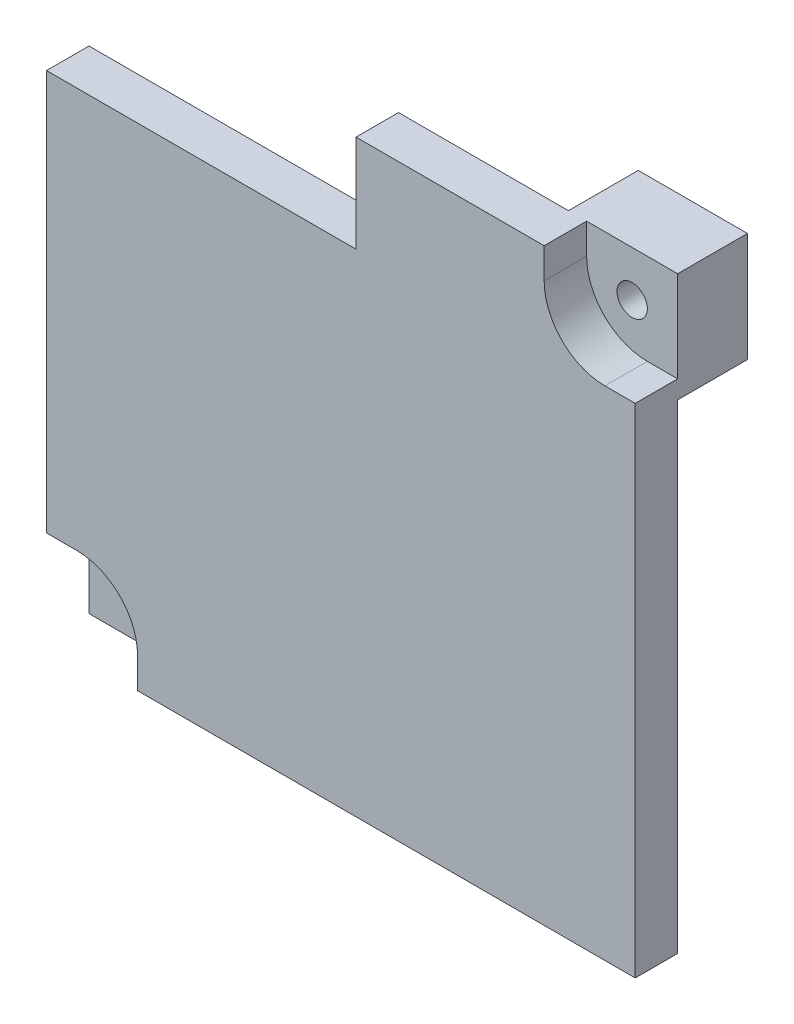
ISO-10303-21;
HEADER;
FILE_DESCRIPTION(('STEP AP214'),'2;1');
FILE_NAME('part.step','',(''),(''),'','','');
FILE_SCHEMA(('AUTOMOTIVE_DESIGN { 1 0 10303 214 1 1 1 1 }'));
ENDSEC;
DATA;
#1=APPLICATION_CONTEXT('core data for automotive mechanical design processes');
#2=APPLICATION_PROTOCOL_DEFINITION('international standard','automotive_design',2000,#1);
#3=PRODUCT_CONTEXT('',#1,'mechanical');
#4=PRODUCT('Part','Part','',(#3));
#5=PRODUCT_RELATED_PRODUCT_CATEGORY('part','',(#4));
#6=PRODUCT_DEFINITION_FORMATION('','',#4);
#7=PRODUCT_DEFINITION_CONTEXT('part definition',#1,'design');
#8=PRODUCT_DEFINITION('design','',#6,#7);
#9=PRODUCT_DEFINITION_SHAPE('','',#8);
#10=(LENGTH_UNIT() NAMED_UNIT(*) SI_UNIT(.MILLI.,.METRE.));
#11=(NAMED_UNIT(*) PLANE_ANGLE_UNIT() SI_UNIT($,.RADIAN.));
#12=(NAMED_UNIT(*) SI_UNIT($,.STERADIAN.) SOLID_ANGLE_UNIT());
#13=UNCERTAINTY_MEASURE_WITH_UNIT(LENGTH_MEASURE(1.E-05),#10,'distance_accuracy_value','');
#14=(GEOMETRIC_REPRESENTATION_CONTEXT(3) GLOBAL_UNCERTAINTY_ASSIGNED_CONTEXT((#13)) GLOBAL_UNIT_ASSIGNED_CONTEXT((#10,
#11,#12)) REPRESENTATION_CONTEXT('',''));
#15=CARTESIAN_POINT('',(0.,0.,0.));
#16=DIRECTION('',(0.,0.,1.));
#17=DIRECTION('',(1.,0.,0.));
#18=AXIS2_PLACEMENT_3D('',#15,#16,#17);
#19=CARTESIAN_POINT('',(0.,0.,0.));
#20=DIRECTION('',(0.,0.,1.));
#21=DIRECTION('',(1.,0.,0.));
#22=AXIS2_PLACEMENT_3D('',#19,#20,#21);
#23=PLANE('',#22);
#24=DIRECTION('',(0.,1.,0.));
#25=VECTOR('',#24,1.);
#26=CARTESIAN_POINT('',(6.1,6.1,0.));
#27=LINE('',#26,#25);
#28=CARTESIAN_POINT('',(6.1,6.1,0.));
#29=VERTEX_POINT('',#28);
#30=CARTESIAN_POINT('',(6.1,9.7,0.));
#31=VERTEX_POINT('',#30);
#32=EDGE_CURVE('E426',#29,#31,#27,.T.);
#33=ORIENTED_EDGE('',*,*,#32,.F.);
#34=DIRECTION('',(-1.,0.,0.));
#35=VECTOR('',#34,1.);
#36=CARTESIAN_POINT('',(9.7,6.1,0.));
#37=LINE('',#36,#35);
#38=CARTESIAN_POINT('',(9.7,6.1,0.));
#39=VERTEX_POINT('',#38);
#40=EDGE_CURVE('E67',#39,#29,#37,.T.);
#41=ORIENTED_EDGE('',*,*,#40,.F.);
#42=DIRECTION('',(0.,1.,0.));
#43=VECTOR('',#42,1.);
#44=CARTESIAN_POINT('',(9.7,0.,0.));
#45=LINE('',#44,#43);
#46=CARTESIAN_POINT('',(9.7,-9.7,0.));
#47=VERTEX_POINT('',#46);
#48=EDGE_CURVE('E207',#47,#39,#45,.T.);
#49=ORIENTED_EDGE('',*,*,#48,.F.);
#50=DIRECTION('',(-1.,0.,0.));
#51=VECTOR('',#50,1.);
#52=CARTESIAN_POINT('',(0.,-9.7,0.));
#53=LINE('',#52,#51);
#54=CARTESIAN_POINT('',(-0.199999999999997,-9.7,0.));
#55=VERTEX_POINT('',#54);
#56=EDGE_CURVE('E63',#47,#55,#53,.T.);
#57=ORIENTED_EDGE('',*,*,#56,.T.);
#58=DIRECTION('',(0.,-1.,0.));
#59=VECTOR('',#58,1.);
#60=CARTESIAN_POINT('',(-0.199999999999997,-9.7,0.));
#61=LINE('',#60,#59);
#62=CARTESIAN_POINT('',(-0.199999999999997,-0.199999999999995,0.));
#63=VERTEX_POINT('',#62);
#64=EDGE_CURVE('E253',#63,#55,#61,.T.);
#65=ORIENTED_EDGE('',*,*,#64,.F.);
#66=DIRECTION('',(1.,0.,0.));
#67=VECTOR('',#66,1.);
#68=CARTESIAN_POINT('',(-0.199999999999997,-0.199999999999995,0.));
#69=LINE('',#68,#67);
#70=CARTESIAN_POINT('',(-9.7,-0.199999999999995,0.));
#71=VERTEX_POINT('',#70);
#72=EDGE_CURVE('E239',#71,#63,#69,.T.);
#73=ORIENTED_EDGE('',*,*,#72,.F.);
#74=DIRECTION('',(0.,1.,0.));
#75=VECTOR('',#74,1.);
#76=CARTESIAN_POINT('',(-9.7,0.,0.));
#77=LINE('',#76,#75);
#78=CARTESIAN_POINT('',(-9.7,6.5,0.));
#79=VERTEX_POINT('',#78);
#80=EDGE_CURVE('E337',#71,#79,#77,.T.);
#81=ORIENTED_EDGE('',*,*,#80,.T.);
#82=DIRECTION('',(1.,0.,0.));
#83=VECTOR('',#82,1.);
#84=CARTESIAN_POINT('',(0.,6.5,0.));
#85=LINE('',#84,#83);
#86=CARTESIAN_POINT('',(0.499999999999997,6.5,0.));
#87=VERTEX_POINT('',#86);
#88=EDGE_CURVE('E339',#79,#87,#85,.T.);
#89=ORIENTED_EDGE('',*,*,#88,.T.);
#90=DIRECTION('',(0.,-1.,0.));
#91=VECTOR('',#90,1.);
#92=CARTESIAN_POINT('',(0.499999999999998,0.,0.));
#93=LINE('',#92,#91);
#94=CARTESIAN_POINT('',(0.499999999999997,9.7,0.));
#95=VERTEX_POINT('',#94);
#96=EDGE_CURVE('E335',#95,#87,#93,.T.);
#97=ORIENTED_EDGE('',*,*,#96,.F.);
#98=DIRECTION('',(-1.,0.,0.));
#99=VECTOR('',#98,1.);
#100=CARTESIAN_POINT('',(0.,9.7,0.));
#101=LINE('',#100,#99);
#102=EDGE_CURVE('E328',#31,#95,#101,.T.);
#103=ORIENTED_EDGE('',*,*,#102,.F.);
#104=EDGE_LOOP('',(#33,#41,#49,#57,#65,#73,#81,#89,#97,#103));
#105=FACE_BOUND('',#104,.T.);
#106=ADVANCED_FACE('F50',(#105),#23,.F.);
#107=CARTESIAN_POINT('',(-8.7,-8.7,1.4));
#108=DIRECTION('',(0.,0.,-1.));
#109=DIRECTION('',(-1.,0.,0.));
#110=AXIS2_PLACEMENT_3D('',#107,#108,#109);
#111=CYLINDRICAL_SURFACE('',#110,2.);
#112=CARTESIAN_POINT('',(-8.7,-8.7,0.));
#113=DIRECTION('',(0.,0.,1.));
#114=DIRECTION('',(1.,0.,0.));
#115=AXIS2_PLACEMENT_3D('',#112,#113,#114);
#116=CIRCLE('',#115,2.);
#117=CARTESIAN_POINT('',(-6.7,-8.70000000000001,0.));
#118=VERTEX_POINT('',#117);
#119=CARTESIAN_POINT('',(-8.70000000000001,-6.7,0.));
#120=VERTEX_POINT('',#119);
#121=EDGE_CURVE('E211',#118,#120,#116,.T.);
#122=ORIENTED_EDGE('',*,*,#121,.F.);
#123=DIRECTION('',(0.,0.,-1.));
#124=VECTOR('',#123,1.);
#125=CARTESIAN_POINT('',(-6.7,-8.70000000000001,1.4));
#126=LINE('',#125,#124);
#127=CARTESIAN_POINT('',(-6.7,-8.70000000000001,1.4));
#128=VERTEX_POINT('',#127);
#129=EDGE_CURVE('E11',#128,#118,#126,.T.);
#130=ORIENTED_EDGE('',*,*,#129,.F.);
#131=CARTESIAN_POINT('',(-8.7,-8.7,1.4));
#132=DIRECTION('',(0.,0.,1.));
#133=DIRECTION('',(1.,0.,0.));
#134=AXIS2_PLACEMENT_3D('',#131,#132,#133);
#135=CIRCLE('',#134,2.);
#136=CARTESIAN_POINT('',(-8.70000000000001,-6.7,1.4));
#137=VERTEX_POINT('',#136);
#138=EDGE_CURVE('E270',#128,#137,#135,.T.);
#139=ORIENTED_EDGE('',*,*,#138,.T.);
#140=DIRECTION('',(0.,0.,-1.));
#141=VECTOR('',#140,1.);
#142=CARTESIAN_POINT('',(-8.70000000000001,-6.7,1.4));
#143=LINE('',#142,#141);
#144=EDGE_CURVE('E310',#137,#120,#143,.T.);
#145=ORIENTED_EDGE('',*,*,#144,.T.);
#146=EDGE_LOOP('',(#122,#130,#139,#145));
#147=FACE_BOUND('',#146,.T.);
#148=ADVANCED_FACE('F47',(#147),#111,.F.);
#149=CARTESIAN_POINT('',(-6.7,0.,1.4));
#150=DIRECTION('',(-1.,0.,0.));
#151=DIRECTION('',(0.,0.,1.));
#152=AXIS2_PLACEMENT_3D('',#149,#150,#151);
#153=PLANE('',#152);
#154=DIRECTION('',(0.,1.,0.));
#155=VECTOR('',#154,1.);
#156=CARTESIAN_POINT('',(-6.7,0.,0.));
#157=LINE('',#156,#155);
#158=CARTESIAN_POINT('',(-6.7,-9.7,0.));
#159=VERTEX_POINT('',#158);
#160=EDGE_CURVE('E216',#159,#118,#157,.T.);
#161=ORIENTED_EDGE('',*,*,#160,.F.);
#162=DIRECTION('',(0.,0.,-1.));
#163=VECTOR('',#162,1.);
#164=CARTESIAN_POINT('',(-6.7,-9.7,1.4));
#165=LINE('',#164,#163);
#166=CARTESIAN_POINT('',(-6.7,-9.7,1.4));
#167=VERTEX_POINT('',#166);
#168=EDGE_CURVE('E60',#167,#159,#165,.T.);
#169=ORIENTED_EDGE('',*,*,#168,.F.);
#170=DIRECTION('',(0.,1.,0.));
#171=VECTOR('',#170,1.);
#172=CARTESIAN_POINT('',(-6.7,0.,1.4));
#173=LINE('',#172,#171);
#174=EDGE_CURVE('E271',#167,#128,#173,.T.);
#175=ORIENTED_EDGE('',*,*,#174,.T.);
#176=ORIENTED_EDGE('',*,*,#129,.T.);
#177=EDGE_LOOP('',(#161,#169,#175,#176));
#178=FACE_BOUND('',#177,.T.);
#179=ADVANCED_FACE('F390',(#178),#153,.T.);
#180=CARTESIAN_POINT('',(0.,-9.7,1.4));
#181=DIRECTION('',(0.,-1.,0.));
#182=DIRECTION('',(1.,0.,0.));
#183=AXIS2_PLACEMENT_3D('',#180,#181,#182);
#184=PLANE('',#183);
#185=ORIENTED_EDGE('',*,*,#56,.F.);
#186=DIRECTION('',(0.,0.,-1.));
#187=VECTOR('',#186,1.);
#188=CARTESIAN_POINT('',(9.7,-9.7,1.4));
#189=LINE('',#188,#187);
#190=CARTESIAN_POINT('',(9.7,-9.7,1.4));
#191=VERTEX_POINT('',#190);
#192=EDGE_CURVE('E374',#191,#47,#189,.T.);
#193=ORIENTED_EDGE('',*,*,#192,.F.);
#194=DIRECTION('',(-1.,0.,0.));
#195=VECTOR('',#194,1.);
#196=CARTESIAN_POINT('',(0.,-9.7,1.4));
#197=LINE('',#196,#195);
#198=EDGE_CURVE('E277',#191,#167,#197,.T.);
#199=ORIENTED_EDGE('',*,*,#198,.T.);
#200=ORIENTED_EDGE('',*,*,#168,.T.);
#201=DIRECTION('',(-1.,0.,0.));
#202=VECTOR('',#201,1.);
#203=CARTESIAN_POINT('',(-0.199999999999997,-9.7,0.));
#204=LINE('',#203,#202);
#205=CARTESIAN_POINT('',(-9.7,-9.7,0.));
#206=VERTEX_POINT('',#205);
#207=EDGE_CURVE('E246',#159,#206,#204,.T.);
#208=ORIENTED_EDGE('',*,*,#207,.T.);
#209=DIRECTION('',(0.,0.,1.));
#210=VECTOR('',#209,1.);
#211=CARTESIAN_POINT('',(-9.7,-9.7,-2.3));
#212=LINE('',#211,#210);
#213=CARTESIAN_POINT('',(-9.7,-9.7,-2.3));
#214=VERTEX_POINT('',#213);
#215=EDGE_CURVE('E223',#214,#206,#212,.T.);
#216=ORIENTED_EDGE('',*,*,#215,.F.);
#217=DIRECTION('',(-1.,0.,0.));
#218=VECTOR('',#217,1.);
#219=CARTESIAN_POINT('',(-0.199999999999997,-9.7,-2.3));
#220=LINE('',#219,#218);
#221=CARTESIAN_POINT('',(-0.199999999999997,-9.7,-2.3));
#222=VERTEX_POINT('',#221);
#223=EDGE_CURVE('E261',#222,#214,#220,.T.);
#224=ORIENTED_EDGE('',*,*,#223,.F.);
#225=DIRECTION('',(0.,0.,1.));
#226=VECTOR('',#225,1.);
#227=CARTESIAN_POINT('',(-0.199999999999997,-9.7,-2.3));
#228=LINE('',#227,#226);
#229=EDGE_CURVE('E225',#222,#55,#228,.T.);
#230=ORIENTED_EDGE('',*,*,#229,.T.);
#231=EDGE_LOOP('',(#185,#193,#199,#200,#208,#216,#224,#230));
#232=FACE_BOUND('',#231,.T.);
#233=ADVANCED_FACE('F381',(#232),#184,.T.);
#234=CARTESIAN_POINT('',(9.7,0.,1.4));
#235=DIRECTION('',(-1.,0.,0.));
#236=DIRECTION('',(0.,-1.,0.));
#237=AXIS2_PLACEMENT_3D('',#234,#235,#236);
#238=PLANE('',#237);
#239=ORIENTED_EDGE('',*,*,#48,.T.);
#240=DIRECTION('',(0.,0.,1.));
#241=VECTOR('',#240,1.);
#242=CARTESIAN_POINT('',(9.7,6.1,-2.3));
#243=LINE('',#242,#241);
#244=CARTESIAN_POINT('',(9.7,6.1,-2.3));
#245=VERTEX_POINT('',#244);
#246=EDGE_CURVE('E188',#245,#39,#243,.T.);
#247=ORIENTED_EDGE('',*,*,#246,.F.);
#248=DIRECTION('',(0.,-1.,0.));
#249=VECTOR('',#248,1.);
#250=CARTESIAN_POINT('',(9.7,6.1,-2.3));
#251=LINE('',#250,#249);
#252=CARTESIAN_POINT('',(9.7,9.7,-2.3));
#253=VERTEX_POINT('',#252);
#254=EDGE_CURVE('E198',#253,#245,#251,.T.);
#255=ORIENTED_EDGE('',*,*,#254,.F.);
#256=DIRECTION('',(0.,0.,1.));
#257=VECTOR('',#256,1.);
#258=CARTESIAN_POINT('',(9.7,9.7,-2.3));
#259=LINE('',#258,#257);
#260=CARTESIAN_POINT('',(9.7,9.7,0.));
#261=VERTEX_POINT('',#260);
#262=EDGE_CURVE('E440',#253,#261,#259,.T.);
#263=ORIENTED_EDGE('',*,*,#262,.T.);
#264=DIRECTION('',(0.,-1.,0.));
#265=VECTOR('',#264,1.);
#266=CARTESIAN_POINT('',(9.7,6.1,0.));
#267=LINE('',#266,#265);
#268=CARTESIAN_POINT('',(9.7,6.7,0.));
#269=VERTEX_POINT('',#268);
#270=EDGE_CURVE('E254',#261,#269,#267,.T.);
#271=ORIENTED_EDGE('',*,*,#270,.T.);
#272=DIRECTION('',(0.,0.,-1.));
#273=VECTOR('',#272,1.);
#274=CARTESIAN_POINT('',(9.7,6.7,1.4));
#275=LINE('',#274,#273);
#276=CARTESIAN_POINT('',(9.7,6.7,1.4));
#277=VERTEX_POINT('',#276);
#278=EDGE_CURVE('E375',#277,#269,#275,.T.);
#279=ORIENTED_EDGE('',*,*,#278,.F.);
#280=DIRECTION('',(0.,1.,0.));
#281=VECTOR('',#280,1.);
#282=CARTESIAN_POINT('',(9.7,0.,1.4));
#283=LINE('',#282,#281);
#284=EDGE_CURVE('E278',#191,#277,#283,.T.);
#285=ORIENTED_EDGE('',*,*,#284,.F.);
#286=ORIENTED_EDGE('',*,*,#192,.T.);
#287=EDGE_LOOP('',(#239,#247,#255,#263,#271,#279,#285,#286));
#288=FACE_BOUND('',#287,.T.);
#289=ADVANCED_FACE('F208',(#288),#238,.F.);
#290=CARTESIAN_POINT('',(0.,6.7,1.4));
#291=DIRECTION('',(0.,-1.,0.));
#292=DIRECTION('',(0.,0.,-1.));
#293=AXIS2_PLACEMENT_3D('',#290,#291,#292);
#294=PLANE('',#293);
#295=DIRECTION('',(-1.,0.,0.));
#296=VECTOR('',#295,1.);
#297=CARTESIAN_POINT('',(0.,6.7,0.));
#298=LINE('',#297,#296);
#299=CARTESIAN_POINT('',(8.70000000000002,6.7,0.));
#300=VERTEX_POINT('',#299);
#301=EDGE_CURVE('E318',#269,#300,#298,.T.);
#302=ORIENTED_EDGE('',*,*,#301,.T.);
#303=DIRECTION('',(0.,0.,-1.));
#304=VECTOR('',#303,1.);
#305=CARTESIAN_POINT('',(8.70000000000002,6.7,1.4));
#306=LINE('',#305,#304);
#307=CARTESIAN_POINT('',(8.70000000000002,6.7,1.4));
#308=VERTEX_POINT('',#307);
#309=EDGE_CURVE('E366',#308,#300,#306,.T.);
#310=ORIENTED_EDGE('',*,*,#309,.F.);
#311=DIRECTION('',(-1.,0.,0.));
#312=VECTOR('',#311,1.);
#313=CARTESIAN_POINT('',(0.,6.7,1.4));
#314=LINE('',#313,#312);
#315=EDGE_CURVE('E285',#277,#308,#314,.T.);
#316=ORIENTED_EDGE('',*,*,#315,.F.);
#317=ORIENTED_EDGE('',*,*,#278,.T.);
#318=EDGE_LOOP('',(#302,#310,#316,#317));
#319=FACE_BOUND('',#318,.T.);
#320=ADVANCED_FACE('F460',(#319),#294,.F.);
#321=CARTESIAN_POINT('',(8.7,8.7,1.4));
#322=DIRECTION('',(0.,0.,-1.));
#323=DIRECTION('',(-1.,0.,0.));
#324=AXIS2_PLACEMENT_3D('',#321,#322,#323);
#325=CYLINDRICAL_SURFACE('',#324,2.);
#326=CARTESIAN_POINT('',(8.7,8.7,0.));
#327=DIRECTION('',(0.,0.,1.));
#328=DIRECTION('',(1.,0.,0.));
#329=AXIS2_PLACEMENT_3D('',#326,#327,#328);
#330=CIRCLE('',#329,2.);
#331=CARTESIAN_POINT('',(6.7,8.70000000000001,0.));
#332=VERTEX_POINT('',#331);
#333=EDGE_CURVE('E321',#300,#332,#330,.F.);
#334=ORIENTED_EDGE('',*,*,#333,.T.);
#335=DIRECTION('',(0.,0.,-1.));
#336=VECTOR('',#335,1.);
#337=CARTESIAN_POINT('',(6.7,8.70000000000001,1.4));
#338=LINE('',#337,#336);
#339=CARTESIAN_POINT('',(6.7,8.70000000000001,1.4));
#340=VERTEX_POINT('',#339);
#341=EDGE_CURVE('E364',#340,#332,#338,.T.);
#342=ORIENTED_EDGE('',*,*,#341,.F.);
#343=CARTESIAN_POINT('',(8.7,8.7,1.4));
#344=DIRECTION('',(0.,0.,1.));
#345=DIRECTION('',(1.,0.,0.));
#346=AXIS2_PLACEMENT_3D('',#343,#344,#345);
#347=CIRCLE('',#346,2.);
#348=EDGE_CURVE('E288',#308,#340,#347,.F.);
#349=ORIENTED_EDGE('',*,*,#348,.F.);
#350=ORIENTED_EDGE('',*,*,#309,.T.);
#351=EDGE_LOOP('',(#334,#342,#349,#350));
#352=FACE_BOUND('',#351,.T.);
#353=ADVANCED_FACE('F458',(#352),#325,.F.);
#354=CARTESIAN_POINT('',(6.70000000000001,0.,1.4));
#355=DIRECTION('',(1.,0.,0.));
#356=DIRECTION('',(0.,1.,0.));
#357=AXIS2_PLACEMENT_3D('',#354,#355,#356);
#358=PLANE('',#357);
#359=DIRECTION('',(0.,-1.,0.));
#360=VECTOR('',#359,1.);
#361=CARTESIAN_POINT('',(6.70000000000001,0.,0.));
#362=LINE('',#361,#360);
#363=CARTESIAN_POINT('',(6.7,9.7,0.));
#364=VERTEX_POINT('',#363);
#365=EDGE_CURVE('E324',#364,#332,#362,.T.);
#366=ORIENTED_EDGE('',*,*,#365,.F.);
#367=DIRECTION('',(0.,0.,-1.));
#368=VECTOR('',#367,1.);
#369=CARTESIAN_POINT('',(6.7,9.7,1.4));
#370=LINE('',#369,#368);
#371=CARTESIAN_POINT('',(6.7,9.7,1.4));
#372=VERTEX_POINT('',#371);
#373=EDGE_CURVE('E362',#372,#364,#370,.T.);
#374=ORIENTED_EDGE('',*,*,#373,.F.);
#375=DIRECTION('',(0.,-1.,0.));
#376=VECTOR('',#375,1.);
#377=CARTESIAN_POINT('',(6.70000000000001,0.,1.4));
#378=LINE('',#377,#376);
#379=EDGE_CURVE('E289',#372,#340,#378,.T.);
#380=ORIENTED_EDGE('',*,*,#379,.T.);
#381=ORIENTED_EDGE('',*,*,#341,.T.);
#382=EDGE_LOOP('',(#366,#374,#380,#381));
#383=FACE_BOUND('',#382,.T.);
#384=ADVANCED_FACE('F625',(#383),#358,.T.);
#385=CARTESIAN_POINT('',(0.,9.7,1.4));
#386=DIRECTION('',(0.,-1.,0.));
#387=DIRECTION('',(1.,0.,0.));
#388=AXIS2_PLACEMENT_3D('',#385,#386,#387);
#389=PLANE('',#388);
#390=ORIENTED_EDGE('',*,*,#373,.T.);
#391=DIRECTION('',(1.,0.,0.));
#392=VECTOR('',#391,1.);
#393=CARTESIAN_POINT('',(9.7,9.7,0.));
#394=LINE('',#393,#392);
#395=EDGE_CURVE('E206',#364,#261,#394,.T.);
#396=ORIENTED_EDGE('',*,*,#395,.T.);
#397=ORIENTED_EDGE('',*,*,#262,.F.);
#398=DIRECTION('',(1.,0.,0.));
#399=VECTOR('',#398,1.);
#400=CARTESIAN_POINT('',(9.7,9.7,-2.3));
#401=LINE('',#400,#399);
#402=CARTESIAN_POINT('',(6.1,9.7,-2.3));
#403=VERTEX_POINT('',#402);
#404=EDGE_CURVE('E203',#403,#253,#401,.T.);
#405=ORIENTED_EDGE('',*,*,#404,.F.);
#406=DIRECTION('',(0.,0.,1.));
#407=VECTOR('',#406,1.);
#408=CARTESIAN_POINT('',(6.1,9.7,-2.3));
#409=LINE('',#408,#407);
#410=EDGE_CURVE('E217',#403,#31,#409,.T.);
#411=ORIENTED_EDGE('',*,*,#410,.T.);
#412=ORIENTED_EDGE('',*,*,#102,.T.);
#413=DIRECTION('',(0.,0.,-1.));
#414=VECTOR('',#413,1.);
#415=CARTESIAN_POINT('',(0.499999999999997,9.7,1.4));
#416=LINE('',#415,#414);
#417=CARTESIAN_POINT('',(0.499999999999997,9.7,1.4));
#418=VERTEX_POINT('',#417);
#419=EDGE_CURVE('E356',#418,#95,#416,.T.);
#420=ORIENTED_EDGE('',*,*,#419,.F.);
#421=DIRECTION('',(-1.,0.,0.));
#422=VECTOR('',#421,1.);
#423=CARTESIAN_POINT('',(0.,9.7,1.4));
#424=LINE('',#423,#422);
#425=EDGE_CURVE('E291',#372,#418,#424,.T.);
#426=ORIENTED_EDGE('',*,*,#425,.F.);
#427=EDGE_LOOP('',(#390,#396,#397,#405,#411,#412,#420,#426));
#428=FACE_BOUND('',#427,.T.);
#429=ADVANCED_FACE('F423',(#428),#389,.F.);
#430=CARTESIAN_POINT('',(0.499999999999998,0.,1.4));
#431=DIRECTION('',(1.,0.,0.));
#432=DIRECTION('',(0.,1.,0.));
#433=AXIS2_PLACEMENT_3D('',#430,#431,#432);
#434=PLANE('',#433);
#435=ORIENTED_EDGE('',*,*,#96,.T.);
#436=DIRECTION('',(0.,0.,-1.));
#437=VECTOR('',#436,1.);
#438=CARTESIAN_POINT('',(0.499999999999997,6.5,1.4));
#439=LINE('',#438,#437);
#440=CARTESIAN_POINT('',(0.499999999999997,6.5,1.4));
#441=VERTEX_POINT('',#440);
#442=EDGE_CURVE('E352',#441,#87,#439,.T.);
#443=ORIENTED_EDGE('',*,*,#442,.F.);
#444=DIRECTION('',(0.,-1.,0.));
#445=VECTOR('',#444,1.);
#446=CARTESIAN_POINT('',(0.499999999999998,0.,1.4));
#447=LINE('',#446,#445);
#448=EDGE_CURVE('E299',#418,#441,#447,.T.);
#449=ORIENTED_EDGE('',*,*,#448,.F.);
#450=ORIENTED_EDGE('',*,*,#419,.T.);
#451=EDGE_LOOP('',(#435,#443,#449,#450));
#452=FACE_BOUND('',#451,.T.);
#453=ADVANCED_FACE('F417',(#452),#434,.F.);
#454=CARTESIAN_POINT('',(0.,6.5,1.4));
#455=DIRECTION('',(0.,1.,0.));
#456=DIRECTION('',(0.,0.,1.));
#457=AXIS2_PLACEMENT_3D('',#454,#455,#456);
#458=PLANE('',#457);
#459=ORIENTED_EDGE('',*,*,#88,.F.);
#460=DIRECTION('',(0.,0.,-1.));
#461=VECTOR('',#460,1.);
#462=CARTESIAN_POINT('',(-9.7,6.5,1.4));
#463=LINE('',#462,#461);
#464=CARTESIAN_POINT('',(-9.7,6.5,1.4));
#465=VERTEX_POINT('',#464);
#466=EDGE_CURVE('E354',#465,#79,#463,.T.);
#467=ORIENTED_EDGE('',*,*,#466,.F.);
#468=DIRECTION('',(1.,0.,0.));
#469=VECTOR('',#468,1.);
#470=CARTESIAN_POINT('',(0.,6.5,1.4));
#471=LINE('',#470,#469);
#472=EDGE_CURVE('E298',#465,#441,#471,.T.);
#473=ORIENTED_EDGE('',*,*,#472,.T.);
#474=ORIENTED_EDGE('',*,*,#442,.T.);
#475=EDGE_LOOP('',(#459,#467,#473,#474));
#476=FACE_BOUND('',#475,.T.);
#477=ADVANCED_FACE('F415',(#476),#458,.T.);
#478=CARTESIAN_POINT('',(-9.7,0.,1.4));
#479=DIRECTION('',(-1.,0.,0.));
#480=DIRECTION('',(0.,-1.,0.));
#481=AXIS2_PLACEMENT_3D('',#478,#479,#480);
#482=PLANE('',#481);
#483=ORIENTED_EDGE('',*,*,#80,.F.);
#484=DIRECTION('',(0.,0.,1.));
#485=VECTOR('',#484,1.);
#486=CARTESIAN_POINT('',(-9.7,-0.199999999999995,-2.3));
#487=LINE('',#486,#485);
#488=CARTESIAN_POINT('',(-9.7,-0.199999999999995,-2.3));
#489=VERTEX_POINT('',#488);
#490=EDGE_CURVE('E227',#489,#71,#487,.T.);
#491=ORIENTED_EDGE('',*,*,#490,.F.);
#492=DIRECTION('',(0.,1.,0.));
#493=VECTOR('',#492,1.);
#494=CARTESIAN_POINT('',(-9.7,-9.7,-2.3));
#495=LINE('',#494,#493);
#496=EDGE_CURVE('E256',#214,#489,#495,.T.);
#497=ORIENTED_EDGE('',*,*,#496,.F.);
#498=ORIENTED_EDGE('',*,*,#215,.T.);
#499=DIRECTION('',(0.,1.,0.));
#500=VECTOR('',#499,1.);
#501=CARTESIAN_POINT('',(-9.7,-9.7,0.));
#502=LINE('',#501,#500);
#503=CARTESIAN_POINT('',(-9.7,-6.7,0.));
#504=VERTEX_POINT('',#503);
#505=EDGE_CURVE('E245',#206,#504,#502,.T.);
#506=ORIENTED_EDGE('',*,*,#505,.T.);
#507=DIRECTION('',(0.,0.,-1.));
#508=VECTOR('',#507,1.);
#509=CARTESIAN_POINT('',(-9.7,-6.7,1.4));
#510=LINE('',#509,#508);
#511=CARTESIAN_POINT('',(-9.7,-6.7,1.4));
#512=VERTEX_POINT('',#511);
#513=EDGE_CURVE('E346',#512,#504,#510,.T.);
#514=ORIENTED_EDGE('',*,*,#513,.F.);
#515=DIRECTION('',(0.,1.,0.));
#516=VECTOR('',#515,1.);
#517=CARTESIAN_POINT('',(-9.7,0.,1.4));
#518=LINE('',#517,#516);
#519=EDGE_CURVE('E301',#512,#465,#518,.T.);
#520=ORIENTED_EDGE('',*,*,#519,.T.);
#521=ORIENTED_EDGE('',*,*,#466,.T.);
#522=EDGE_LOOP('',(#483,#491,#497,#498,#506,#514,#520,#521));
#523=FACE_BOUND('',#522,.T.);
#524=ADVANCED_FACE('F392',(#523),#482,.T.);
#525=CARTESIAN_POINT('',(0.,-6.7,1.4));
#526=DIRECTION('',(0.,1.,0.));
#527=DIRECTION('',(0.,0.,1.));
#528=AXIS2_PLACEMENT_3D('',#525,#526,#527);
#529=PLANE('',#528);
#530=DIRECTION('',(1.,0.,0.));
#531=VECTOR('',#530,1.);
#532=CARTESIAN_POINT('',(0.,-6.7,0.));
#533=LINE('',#532,#531);
#534=EDGE_CURVE('E275',#504,#120,#533,.T.);
#535=ORIENTED_EDGE('',*,*,#534,.T.);
#536=ORIENTED_EDGE('',*,*,#144,.F.);
#537=DIRECTION('',(1.,0.,0.));
#538=VECTOR('',#537,1.);
#539=CARTESIAN_POINT('',(0.,-6.7,1.4));
#540=LINE('',#539,#538);
#541=EDGE_CURVE('E307',#512,#137,#540,.T.);
#542=ORIENTED_EDGE('',*,*,#541,.F.);
#543=ORIENTED_EDGE('',*,*,#513,.T.);
#544=EDGE_LOOP('',(#535,#536,#542,#543));
#545=FACE_BOUND('',#544,.T.);
#546=ADVANCED_FACE('F469',(#545),#529,.F.);
#547=CARTESIAN_POINT('',(0.,0.,1.4));
#548=DIRECTION('',(0.,0.,1.));
#549=DIRECTION('',(1.,0.,0.));
#550=AXIS2_PLACEMENT_3D('',#547,#548,#549);
#551=PLANE('',#550);
#552=ORIENTED_EDGE('',*,*,#138,.F.);
#553=ORIENTED_EDGE('',*,*,#174,.F.);
#554=ORIENTED_EDGE('',*,*,#198,.F.);
#555=ORIENTED_EDGE('',*,*,#284,.T.);
#556=ORIENTED_EDGE('',*,*,#315,.T.);
#557=ORIENTED_EDGE('',*,*,#348,.T.);
#558=ORIENTED_EDGE('',*,*,#379,.F.);
#559=ORIENTED_EDGE('',*,*,#425,.T.);
#560=ORIENTED_EDGE('',*,*,#448,.T.);
#561=ORIENTED_EDGE('',*,*,#472,.F.);
#562=ORIENTED_EDGE('',*,*,#519,.F.);
#563=ORIENTED_EDGE('',*,*,#541,.T.);
#564=EDGE_LOOP('',(#552,#553,#554,#555,#556,#557,#558,#559,#560,#561,#562,#563));
#565=FACE_BOUND('',#564,.T.);
#566=ADVANCED_FACE('F463',(#565),#551,.T.);
#567=CARTESIAN_POINT('',(0.,0.,0.));
#568=DIRECTION('',(0.,0.,1.));
#569=DIRECTION('',(1.,0.,0.));
#570=AXIS2_PLACEMENT_3D('',#567,#568,#569);
#571=PLANE('',#570);
#572=CARTESIAN_POINT('',(-8.2,-8.2,0.));
#573=DIRECTION('',(0.,0.,1.));
#574=DIRECTION('',(1.,0.,0.));
#575=AXIS2_PLACEMENT_3D('',#572,#573,#574);
#576=CIRCLE('',#575,0.500000000000001);
#577=CARTESIAN_POINT('',(-7.7,-8.2,0.));
#578=VERTEX_POINT('',#577);
#579=EDGE_CURVE('E229',#578,#578,#576,.T.);
#580=ORIENTED_EDGE('',*,*,#579,.F.);
#581=EDGE_LOOP('',(#580));
#582=FACE_BOUND('',#581,.T.);
#583=ORIENTED_EDGE('',*,*,#534,.F.);
#584=ORIENTED_EDGE('',*,*,#505,.F.);
#585=ORIENTED_EDGE('',*,*,#207,.F.);
#586=ORIENTED_EDGE('',*,*,#160,.T.);
#587=ORIENTED_EDGE('',*,*,#121,.T.);
#588=EDGE_LOOP('',(#583,#584,#585,#586,#587));
#589=FACE_BOUND('',#588,.T.);
#590=ADVANCED_FACE('F391',(#582,#589),#571,.T.);
#591=CARTESIAN_POINT('',(-0.199999999999997,-9.7,-2.3));
#592=DIRECTION('',(-1.,0.,0.));
#593=DIRECTION('',(0.,0.,1.));
#594=AXIS2_PLACEMENT_3D('',#591,#592,#593);
#595=PLANE('',#594);
#596=ORIENTED_EDGE('',*,*,#64,.T.);
#597=ORIENTED_EDGE('',*,*,#229,.F.);
#598=DIRECTION('',(0.,-1.,0.));
#599=VECTOR('',#598,1.);
#600=CARTESIAN_POINT('',(-0.199999999999997,-9.7,-2.3));
#601=LINE('',#600,#599);
#602=CARTESIAN_POINT('',(-0.199999999999997,-0.199999999999995,-2.3));
#603=VERTEX_POINT('',#602);
#604=EDGE_CURVE('E243',#603,#222,#601,.T.);
#605=ORIENTED_EDGE('',*,*,#604,.F.);
#606=DIRECTION('',(0.,0.,1.));
#607=VECTOR('',#606,1.);
#608=CARTESIAN_POINT('',(-0.199999999999997,-0.199999999999995,-2.3));
#609=LINE('',#608,#607);
#610=EDGE_CURVE('E234',#603,#63,#609,.T.);
#611=ORIENTED_EDGE('',*,*,#610,.T.);
#612=EDGE_LOOP('',(#596,#597,#605,#611));
#613=FACE_BOUND('',#612,.T.);
#614=ADVANCED_FACE('F409',(#613),#595,.F.);
#615=CARTESIAN_POINT('',(-0.199999999999997,-0.199999999999995,-2.3));
#616=DIRECTION('',(0.,-1.,0.));
#617=DIRECTION('',(0.,0.,-1.));
#618=AXIS2_PLACEMENT_3D('',#615,#616,#617);
#619=PLANE('',#618);
#620=ORIENTED_EDGE('',*,*,#72,.T.);
#621=ORIENTED_EDGE('',*,*,#610,.F.);
#622=DIRECTION('',(1.,0.,0.));
#623=VECTOR('',#622,1.);
#624=CARTESIAN_POINT('',(-0.199999999999997,-0.199999999999995,-2.3));
#625=LINE('',#624,#623);
#626=EDGE_CURVE('E236',#489,#603,#625,.T.);
#627=ORIENTED_EDGE('',*,*,#626,.F.);
#628=ORIENTED_EDGE('',*,*,#490,.T.);
#629=EDGE_LOOP('',(#620,#621,#627,#628));
#630=FACE_BOUND('',#629,.T.);
#631=ADVANCED_FACE('F410',(#630),#619,.F.);
#632=CARTESIAN_POINT('',(0.,0.,-2.3));
#633=DIRECTION('',(0.,0.,1.));
#634=DIRECTION('',(1.,0.,0.));
#635=AXIS2_PLACEMENT_3D('',#632,#633,#634);
#636=PLANE('',#635);
#637=CARTESIAN_POINT('',(-8.2,-8.2,-2.3));
#638=DIRECTION('',(0.,0.,1.));
#639=DIRECTION('',(1.,0.,0.));
#640=AXIS2_PLACEMENT_3D('',#637,#638,#639);
#641=CIRCLE('',#640,0.500000000000001);
#642=CARTESIAN_POINT('',(-7.7,-8.2,-2.3));
#643=VERTEX_POINT('',#642);
#644=EDGE_CURVE('E517',#643,#643,#641,.T.);
#645=ORIENTED_EDGE('',*,*,#644,.T.);
#646=EDGE_LOOP('',(#645));
#647=FACE_BOUND('',#646,.T.);
#648=ORIENTED_EDGE('',*,*,#604,.T.);
#649=ORIENTED_EDGE('',*,*,#223,.T.);
#650=ORIENTED_EDGE('',*,*,#496,.T.);
#651=ORIENTED_EDGE('',*,*,#626,.T.);
#652=EDGE_LOOP('',(#648,#649,#650,#651));
#653=FACE_BOUND('',#652,.T.);
#654=ADVANCED_FACE('F405',(#647,#653),#636,.F.);
#655=CARTESIAN_POINT('',(9.7,6.1,-2.3));
#656=DIRECTION('',(0.,1.,0.));
#657=DIRECTION('',(0.,0.,1.));
#658=AXIS2_PLACEMENT_3D('',#655,#656,#657);
#659=PLANE('',#658);
#660=ORIENTED_EDGE('',*,*,#40,.T.);
#661=DIRECTION('',(0.,0.,1.));
#662=VECTOR('',#661,1.);
#663=CARTESIAN_POINT('',(6.1,6.1,-2.3));
#664=LINE('',#663,#662);
#665=CARTESIAN_POINT('',(6.1,6.1,-2.3));
#666=VERTEX_POINT('',#665);
#667=EDGE_CURVE('E193',#666,#29,#664,.T.);
#668=ORIENTED_EDGE('',*,*,#667,.F.);
#669=DIRECTION('',(-1.,0.,0.));
#670=VECTOR('',#669,1.);
#671=CARTESIAN_POINT('',(9.7,6.1,-2.3));
#672=LINE('',#671,#670);
#673=EDGE_CURVE('E183',#245,#666,#672,.T.);
#674=ORIENTED_EDGE('',*,*,#673,.F.);
#675=ORIENTED_EDGE('',*,*,#246,.T.);
#676=EDGE_LOOP('',(#660,#668,#674,#675));
#677=FACE_BOUND('',#676,.T.);
#678=ADVANCED_FACE('F186',(#677),#659,.F.);
#679=CARTESIAN_POINT('',(6.1,6.1,-2.3));
#680=DIRECTION('',(1.,0.,0.));
#681=DIRECTION('',(0.,1.,0.));
#682=AXIS2_PLACEMENT_3D('',#679,#680,#681);
#683=PLANE('',#682);
#684=ORIENTED_EDGE('',*,*,#32,.T.);
#685=ORIENTED_EDGE('',*,*,#410,.F.);
#686=DIRECTION('',(0.,1.,0.));
#687=VECTOR('',#686,1.);
#688=CARTESIAN_POINT('',(6.1,6.1,-2.3));
#689=LINE('',#688,#687);
#690=EDGE_CURVE('E192',#666,#403,#689,.T.);
#691=ORIENTED_EDGE('',*,*,#690,.F.);
#692=ORIENTED_EDGE('',*,*,#667,.T.);
#693=EDGE_LOOP('',(#684,#685,#691,#692));
#694=FACE_BOUND('',#693,.T.);
#695=ADVANCED_FACE('F428',(#694),#683,.F.);
#696=CARTESIAN_POINT('',(0.,0.,-2.3));
#697=DIRECTION('',(0.,0.,1.));
#698=DIRECTION('',(1.,0.,0.));
#699=AXIS2_PLACEMENT_3D('',#696,#697,#698);
#700=PLANE('',#699);
#701=CARTESIAN_POINT('',(8.2,8.2,-2.3));
#702=DIRECTION('',(0.,0.,1.));
#703=DIRECTION('',(1.,0.,0.));
#704=AXIS2_PLACEMENT_3D('',#701,#702,#703);
#705=CIRCLE('',#704,0.500000000000001);
#706=CARTESIAN_POINT('',(8.7,8.2,-2.3));
#707=VERTEX_POINT('',#706);
#708=EDGE_CURVE('E520',#707,#707,#705,.T.);
#709=ORIENTED_EDGE('',*,*,#708,.T.);
#710=EDGE_LOOP('',(#709));
#711=FACE_BOUND('',#710,.T.);
#712=ORIENTED_EDGE('',*,*,#254,.T.);
#713=ORIENTED_EDGE('',*,*,#673,.T.);
#714=ORIENTED_EDGE('',*,*,#690,.T.);
#715=ORIENTED_EDGE('',*,*,#404,.T.);
#716=EDGE_LOOP('',(#712,#713,#714,#715));
#717=FACE_BOUND('',#716,.T.);
#718=ADVANCED_FACE('F200',(#711,#717),#700,.F.);
#719=CARTESIAN_POINT('',(0.,0.,0.));
#720=DIRECTION('',(0.,0.,1.));
#721=DIRECTION('',(1.,0.,0.));
#722=AXIS2_PLACEMENT_3D('',#719,#720,#721);
#723=PLANE('',#722);
#724=CARTESIAN_POINT('',(8.2,8.2,0.));
#725=DIRECTION('',(0.,0.,1.));
#726=DIRECTION('',(1.,0.,0.));
#727=AXIS2_PLACEMENT_3D('',#724,#725,#726);
#728=CIRCLE('',#727,0.500000000000001);
#729=CARTESIAN_POINT('',(8.7,8.2,0.));
#730=VERTEX_POINT('',#729);
#731=EDGE_CURVE('E51',#730,#730,#728,.T.);
#732=ORIENTED_EDGE('',*,*,#731,.F.);
#733=EDGE_LOOP('',(#732));
#734=FACE_BOUND('',#733,.T.);
#735=ORIENTED_EDGE('',*,*,#395,.F.);
#736=ORIENTED_EDGE('',*,*,#365,.T.);
#737=ORIENTED_EDGE('',*,*,#333,.F.);
#738=ORIENTED_EDGE('',*,*,#301,.F.);
#739=ORIENTED_EDGE('',*,*,#270,.F.);
#740=EDGE_LOOP('',(#735,#736,#737,#738,#739));
#741=FACE_BOUND('',#740,.T.);
#742=ADVANCED_FACE('F451',(#734,#741),#723,.T.);
#743=CARTESIAN_POINT('',(8.2,8.2,-2.3));
#744=DIRECTION('',(0.,0.,1.));
#745=DIRECTION('',(1.,0.,0.));
#746=AXIS2_PLACEMENT_3D('',#743,#744,#745);
#747=CYLINDRICAL_SURFACE('',#746,0.500000000000001);
#748=ORIENTED_EDGE('',*,*,#731,.T.);
#749=EDGE_LOOP('',(#748));
#750=FACE_BOUND('',#749,.T.);
#751=ORIENTED_EDGE('',*,*,#708,.F.);
#752=EDGE_LOOP('',(#751));
#753=FACE_BOUND('',#752,.T.);
#754=ADVANCED_FACE('F498',(#750,#753),#747,.F.);
#755=CARTESIAN_POINT('',(-8.2,-8.2,-2.3));
#756=DIRECTION('',(0.,0.,1.));
#757=DIRECTION('',(1.,0.,0.));
#758=AXIS2_PLACEMENT_3D('',#755,#756,#757);
#759=CYLINDRICAL_SURFACE('',#758,0.500000000000001);
#760=ORIENTED_EDGE('',*,*,#579,.T.);
#761=EDGE_LOOP('',(#760));
#762=FACE_BOUND('',#761,.T.);
#763=ORIENTED_EDGE('',*,*,#644,.F.);
#764=EDGE_LOOP('',(#763));
#765=FACE_BOUND('',#764,.T.);
#766=ADVANCED_FACE('F502',(#762,#765),#759,.F.);
#767=CLOSED_SHELL('',(#106,#148,#179,#233,#289,#320,#353,#384,#429,#453,#477,#524,#546,#566,
#590,#614,#631,#654,#678,#695,#718,#742,#754,#766));
#768=MANIFOLD_SOLID_BREP('B2',#767);
#769=ADVANCED_BREP_SHAPE_REPRESENTATION('',(#18,#768),#14);
#770=SHAPE_DEFINITION_REPRESENTATION(#9,#769);
ENDSEC;
END-ISO-10303-21;
